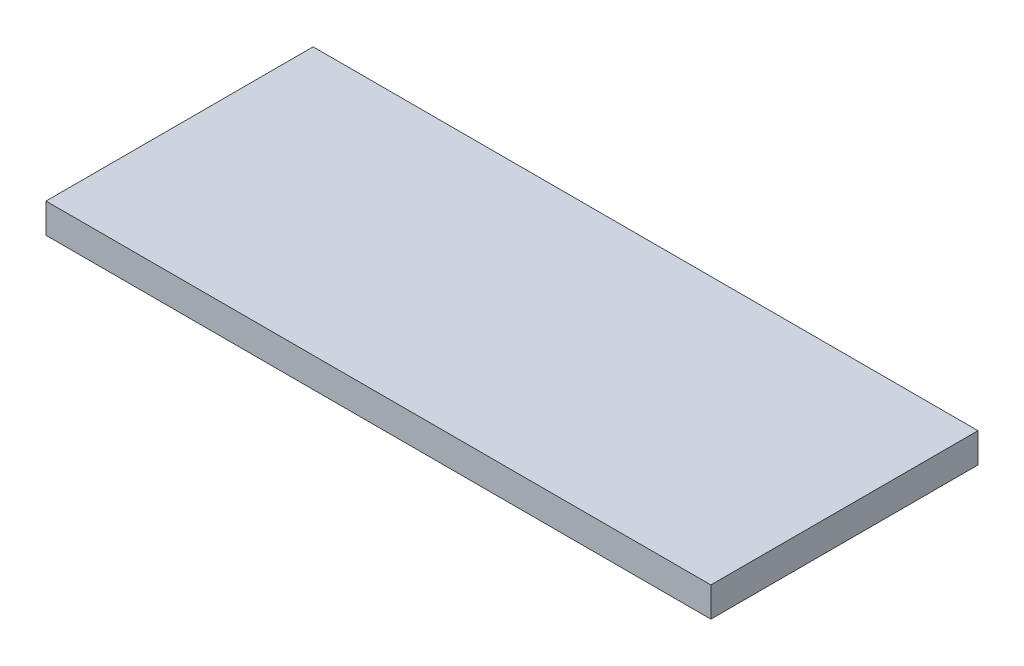
ISO-10303-21;
HEADER;
FILE_DESCRIPTION(('STEP AP214'),'2;1');
FILE_NAME('part.step','',(''),(''),'','','');
FILE_SCHEMA(('AUTOMOTIVE_DESIGN { 1 0 10303 214 1 1 1 1 }'));
ENDSEC;
DATA;
#1=APPLICATION_CONTEXT('core data for automotive mechanical design processes');
#2=APPLICATION_PROTOCOL_DEFINITION('international standard','automotive_design',2000,#1);
#3=PRODUCT_CONTEXT('',#1,'mechanical');
#4=PRODUCT('Part','Part','',(#3));
#5=PRODUCT_RELATED_PRODUCT_CATEGORY('part','',(#4));
#6=PRODUCT_DEFINITION_FORMATION('','',#4);
#7=PRODUCT_DEFINITION_CONTEXT('part definition',#1,'design');
#8=PRODUCT_DEFINITION('design','',#6,#7);
#9=PRODUCT_DEFINITION_SHAPE('','',#8);
#10=(LENGTH_UNIT() NAMED_UNIT(*) SI_UNIT(.MILLI.,.METRE.));
#11=(NAMED_UNIT(*) PLANE_ANGLE_UNIT() SI_UNIT($,.RADIAN.));
#12=(NAMED_UNIT(*) SI_UNIT($,.STERADIAN.) SOLID_ANGLE_UNIT());
#13=UNCERTAINTY_MEASURE_WITH_UNIT(LENGTH_MEASURE(1.E-05),#10,'distance_accuracy_value','');
#14=(GEOMETRIC_REPRESENTATION_CONTEXT(3) GLOBAL_UNCERTAINTY_ASSIGNED_CONTEXT((#13)) GLOBAL_UNIT_ASSIGNED_CONTEXT((#10,
#11,#12)) REPRESENTATION_CONTEXT('',''));
#15=CARTESIAN_POINT('',(0.,0.,0.));
#16=DIRECTION('',(0.,0.,1.));
#17=DIRECTION('',(1.,0.,0.));
#18=AXIS2_PLACEMENT_3D('',#15,#16,#17);
#19=CARTESIAN_POINT('',(-112.,10.,-45.));
#20=DIRECTION('',(1.,0.,0.));
#21=DIRECTION('',(0.,0.,-1.));
#22=AXIS2_PLACEMENT_3D('',#19,#20,#21);
#23=PLANE('',#22);
#24=DIRECTION('',(0.,0.,1.));
#25=VECTOR('',#24,1.);
#26=CARTESIAN_POINT('',(-112.,0.,-45.));
#27=LINE('',#26,#25);
#28=CARTESIAN_POINT('',(-112.,0.,-45.));
#29=VERTEX_POINT('',#28);
#30=CARTESIAN_POINT('',(-112.,0.,45.));
#31=VERTEX_POINT('',#30);
#32=EDGE_CURVE('E97',#29,#31,#27,.T.);
#33=ORIENTED_EDGE('',*,*,#32,.T.);
#34=DIRECTION('',(0.,-1.,0.));
#35=VECTOR('',#34,1.);
#36=CARTESIAN_POINT('',(-112.,10.,45.));
#37=LINE('',#36,#35);
#38=CARTESIAN_POINT('',(-112.,10.,45.));
#39=VERTEX_POINT('',#38);
#40=EDGE_CURVE('E11',#39,#31,#37,.T.);
#41=ORIENTED_EDGE('',*,*,#40,.F.);
#42=DIRECTION('',(0.,0.,1.));
#43=VECTOR('',#42,1.);
#44=CARTESIAN_POINT('',(-112.,10.,-45.));
#45=LINE('',#44,#43);
#46=CARTESIAN_POINT('',(-112.,10.,-45.));
#47=VERTEX_POINT('',#46);
#48=EDGE_CURVE('E85',#47,#39,#45,.T.);
#49=ORIENTED_EDGE('',*,*,#48,.F.);
#50=DIRECTION('',(0.,-1.,0.));
#51=VECTOR('',#50,1.);
#52=CARTESIAN_POINT('',(-112.,10.,-45.));
#53=LINE('',#52,#51);
#54=EDGE_CURVE('E93',#47,#29,#53,.T.);
#55=ORIENTED_EDGE('',*,*,#54,.T.);
#56=EDGE_LOOP('',(#33,#41,#49,#55));
#57=FACE_BOUND('',#56,.T.);
#58=ADVANCED_FACE('F34',(#57),#23,.F.);
#59=CARTESIAN_POINT('',(112.,10.,45.));
#60=DIRECTION('',(0.,0.,-1.));
#61=DIRECTION('',(-1.,0.,0.));
#62=AXIS2_PLACEMENT_3D('',#59,#60,#61);
#63=PLANE('',#62);
#64=DIRECTION('',(1.,0.,0.));
#65=VECTOR('',#64,1.);
#66=CARTESIAN_POINT('',(112.,0.,45.));
#67=LINE('',#66,#65);
#68=CARTESIAN_POINT('',(112.,0.,45.));
#69=VERTEX_POINT('',#68);
#70=EDGE_CURVE('E89',#31,#69,#67,.T.);
#71=ORIENTED_EDGE('',*,*,#70,.T.);
#72=DIRECTION('',(0.,-1.,0.));
#73=VECTOR('',#72,1.);
#74=CARTESIAN_POINT('',(112.,10.,45.));
#75=LINE('',#74,#73);
#76=CARTESIAN_POINT('',(112.,10.,45.));
#77=VERTEX_POINT('',#76);
#78=EDGE_CURVE('E42',#77,#69,#75,.T.);
#79=ORIENTED_EDGE('',*,*,#78,.F.);
#80=DIRECTION('',(1.,0.,0.));
#81=VECTOR('',#80,1.);
#82=CARTESIAN_POINT('',(112.,10.,45.));
#83=LINE('',#82,#81);
#84=EDGE_CURVE('E80',#39,#77,#83,.T.);
#85=ORIENTED_EDGE('',*,*,#84,.F.);
#86=ORIENTED_EDGE('',*,*,#40,.T.);
#87=EDGE_LOOP('',(#71,#79,#85,#86));
#88=FACE_BOUND('',#87,.T.);
#89=ADVANCED_FACE('F88',(#88),#63,.F.);
#90=CARTESIAN_POINT('',(112.,10.,-45.));
#91=DIRECTION('',(-1.,0.,0.));
#92=DIRECTION('',(0.,0.,1.));
#93=AXIS2_PLACEMENT_3D('',#90,#91,#92);
#94=PLANE('',#93);
#95=DIRECTION('',(0.,0.,-1.));
#96=VECTOR('',#95,1.);
#97=CARTESIAN_POINT('',(112.,0.,-45.));
#98=LINE('',#97,#96);
#99=CARTESIAN_POINT('',(112.,0.,-45.));
#100=VERTEX_POINT('',#99);
#101=EDGE_CURVE('E67',#69,#100,#98,.T.);
#102=ORIENTED_EDGE('',*,*,#101,.T.);
#103=DIRECTION('',(0.,-1.,0.));
#104=VECTOR('',#103,1.);
#105=CARTESIAN_POINT('',(112.,10.,-45.));
#106=LINE('',#105,#104);
#107=CARTESIAN_POINT('',(112.,10.,-45.));
#108=VERTEX_POINT('',#107);
#109=EDGE_CURVE('E90',#108,#100,#106,.T.);
#110=ORIENTED_EDGE('',*,*,#109,.F.);
#111=DIRECTION('',(0.,0.,-1.));
#112=VECTOR('',#111,1.);
#113=CARTESIAN_POINT('',(112.,10.,-45.));
#114=LINE('',#113,#112);
#115=EDGE_CURVE('E83',#77,#108,#114,.T.);
#116=ORIENTED_EDGE('',*,*,#115,.F.);
#117=ORIENTED_EDGE('',*,*,#78,.T.);
#118=EDGE_LOOP('',(#102,#110,#116,#117));
#119=FACE_BOUND('',#118,.T.);
#120=ADVANCED_FACE('F91',(#119),#94,.F.);
#121=CARTESIAN_POINT('',(112.,10.,-45.));
#122=DIRECTION('',(0.,0.,1.));
#123=DIRECTION('',(1.,0.,0.));
#124=AXIS2_PLACEMENT_3D('',#121,#122,#123);
#125=PLANE('',#124);
#126=DIRECTION('',(-1.,0.,0.));
#127=VECTOR('',#126,1.);
#128=CARTESIAN_POINT('',(112.,0.,-45.));
#129=LINE('',#128,#127);
#130=EDGE_CURVE('E73',#100,#29,#129,.T.);
#131=ORIENTED_EDGE('',*,*,#130,.T.);
#132=ORIENTED_EDGE('',*,*,#54,.F.);
#133=DIRECTION('',(-1.,0.,0.));
#134=VECTOR('',#133,1.);
#135=CARTESIAN_POINT('',(112.,10.,-45.));
#136=LINE('',#135,#134);
#137=EDGE_CURVE('E50',#108,#47,#136,.T.);
#138=ORIENTED_EDGE('',*,*,#137,.F.);
#139=ORIENTED_EDGE('',*,*,#109,.T.);
#140=EDGE_LOOP('',(#131,#132,#138,#139));
#141=FACE_BOUND('',#140,.T.);
#142=ADVANCED_FACE('F104',(#141),#125,.F.);
#143=CARTESIAN_POINT('',(0.,10.,0.));
#144=DIRECTION('',(0.,-1.,0.));
#145=DIRECTION('',(0.,0.,-1.));
#146=AXIS2_PLACEMENT_3D('',#143,#144,#145);
#147=PLANE('',#146);
#148=ORIENTED_EDGE('',*,*,#48,.T.);
#149=ORIENTED_EDGE('',*,*,#84,.T.);
#150=ORIENTED_EDGE('',*,*,#115,.T.);
#151=ORIENTED_EDGE('',*,*,#137,.T.);
#152=EDGE_LOOP('',(#148,#149,#150,#151));
#153=FACE_BOUND('',#152,.T.);
#154=ADVANCED_FACE('F81',(#153),#147,.F.);
#155=CARTESIAN_POINT('',(0.,0.,0.));
#156=DIRECTION('',(0.,-1.,0.));
#157=DIRECTION('',(0.,0.,-1.));
#158=AXIS2_PLACEMENT_3D('',#155,#156,#157);
#159=PLANE('',#158);
#160=ORIENTED_EDGE('',*,*,#32,.F.);
#161=ORIENTED_EDGE('',*,*,#130,.F.);
#162=ORIENTED_EDGE('',*,*,#101,.F.);
#163=ORIENTED_EDGE('',*,*,#70,.F.);
#164=EDGE_LOOP('',(#160,#161,#162,#163));
#165=FACE_BOUND('',#164,.T.);
#166=ADVANCED_FACE('F107',(#165),#159,.T.);
#167=CLOSED_SHELL('',(#58,#89,#120,#142,#154,#166));
#168=MANIFOLD_SOLID_BREP('B2',#167);
#169=ADVANCED_BREP_SHAPE_REPRESENTATION('',(#18,#168),#14);
#170=SHAPE_DEFINITION_REPRESENTATION(#9,#169);
ENDSEC;
END-ISO-10303-21;
